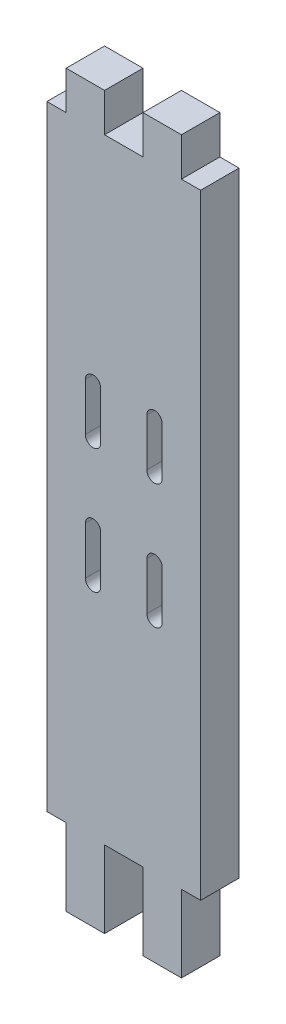
ISO-10303-21;
HEADER;
FILE_DESCRIPTION(('STEP AP214'),'2;1');
FILE_NAME('part.step','',(''),(''),'','','');
FILE_SCHEMA(('AUTOMOTIVE_DESIGN { 1 0 10303 214 1 1 1 1 }'));
ENDSEC;
DATA;
#1=APPLICATION_CONTEXT('core data for automotive mechanical design processes');
#2=APPLICATION_PROTOCOL_DEFINITION('international standard','automotive_design',2000,#1);
#3=PRODUCT_CONTEXT('',#1,'mechanical');
#4=PRODUCT('Part','Part','',(#3));
#5=PRODUCT_RELATED_PRODUCT_CATEGORY('part','',(#4));
#6=PRODUCT_DEFINITION_FORMATION('','',#4);
#7=PRODUCT_DEFINITION_CONTEXT('part definition',#1,'design');
#8=PRODUCT_DEFINITION('design','',#6,#7);
#9=PRODUCT_DEFINITION_SHAPE('','',#8);
#10=(LENGTH_UNIT() NAMED_UNIT(*) SI_UNIT(.MILLI.,.METRE.));
#11=(NAMED_UNIT(*) PLANE_ANGLE_UNIT() SI_UNIT($,.RADIAN.));
#12=(NAMED_UNIT(*) SI_UNIT($,.STERADIAN.) SOLID_ANGLE_UNIT());
#13=UNCERTAINTY_MEASURE_WITH_UNIT(LENGTH_MEASURE(1.E-05),#10,'distance_accuracy_value','');
#14=(GEOMETRIC_REPRESENTATION_CONTEXT(3) GLOBAL_UNCERTAINTY_ASSIGNED_CONTEXT((#13)) GLOBAL_UNIT_ASSIGNED_CONTEXT((#10,
#11,#12)) REPRESENTATION_CONTEXT('',''));
#15=CARTESIAN_POINT('',(0.,0.,0.));
#16=DIRECTION('',(0.,0.,1.));
#17=DIRECTION('',(1.,0.,0.));
#18=AXIS2_PLACEMENT_3D('',#15,#16,#17);
#19=CARTESIAN_POINT('',(0.,0.,5.));
#20=DIRECTION('',(0.,0.,1.));
#21=DIRECTION('',(1.,0.,0.));
#22=AXIS2_PLACEMENT_3D('',#19,#20,#21);
#23=PLANE('',#22);
#24=DIRECTION('',(-1.,0.,0.));
#25=VECTOR('',#24,1.);
#26=CARTESIAN_POINT('',(7.5,40.,5.));
#27=LINE('',#26,#25);
#28=CARTESIAN_POINT('',(10.,40.,5.));
#29=VERTEX_POINT('',#28);
#30=CARTESIAN_POINT('',(7.5,40.,5.));
#31=VERTEX_POINT('',#30);
#32=EDGE_CURVE('E436',#29,#31,#27,.T.);
#33=ORIENTED_EDGE('',*,*,#32,.T.);
#34=DIRECTION('',(0.,1.,0.));
#35=VECTOR('',#34,1.);
#36=CARTESIAN_POINT('',(7.5,45.,5.));
#37=LINE('',#36,#35);
#38=CARTESIAN_POINT('',(7.5,45.,5.));
#39=VERTEX_POINT('',#38);
#40=EDGE_CURVE('E441',#31,#39,#37,.T.);
#41=ORIENTED_EDGE('',*,*,#40,.T.);
#42=DIRECTION('',(-1.,0.,0.));
#43=VECTOR('',#42,1.);
#44=CARTESIAN_POINT('',(2.5,45.,5.));
#45=LINE('',#44,#43);
#46=CARTESIAN_POINT('',(2.5,45.,5.));
#47=VERTEX_POINT('',#46);
#48=EDGE_CURVE('E451',#39,#47,#45,.T.);
#49=ORIENTED_EDGE('',*,*,#48,.T.);
#50=DIRECTION('',(0.,-1.,0.));
#51=VECTOR('',#50,1.);
#52=CARTESIAN_POINT('',(2.5,40.,5.));
#53=LINE('',#52,#51);
#54=CARTESIAN_POINT('',(2.5,40.,5.));
#55=VERTEX_POINT('',#54);
#56=EDGE_CURVE('E454',#47,#55,#53,.T.);
#57=ORIENTED_EDGE('',*,*,#56,.T.);
#58=DIRECTION('',(-1.,0.,0.));
#59=VECTOR('',#58,1.);
#60=CARTESIAN_POINT('',(-2.5,40.,5.));
#61=LINE('',#60,#59);
#62=CARTESIAN_POINT('',(-2.5,40.,5.));
#63=VERTEX_POINT('',#62);
#64=EDGE_CURVE('E458',#55,#63,#61,.T.);
#65=ORIENTED_EDGE('',*,*,#64,.T.);
#66=DIRECTION('',(0.,1.,0.));
#67=VECTOR('',#66,1.);
#68=CARTESIAN_POINT('',(-2.5,45.,5.));
#69=LINE('',#68,#67);
#70=CARTESIAN_POINT('',(-2.5,45.,5.));
#71=VERTEX_POINT('',#70);
#72=EDGE_CURVE('E462',#63,#71,#69,.T.);
#73=ORIENTED_EDGE('',*,*,#72,.T.);
#74=DIRECTION('',(-1.,0.,0.));
#75=VECTOR('',#74,1.);
#76=CARTESIAN_POINT('',(-7.5,45.,5.));
#77=LINE('',#76,#75);
#78=CARTESIAN_POINT('',(-7.5,45.,5.));
#79=VERTEX_POINT('',#78);
#80=EDGE_CURVE('E470',#71,#79,#77,.T.);
#81=ORIENTED_EDGE('',*,*,#80,.T.);
#82=DIRECTION('',(0.,-1.,0.));
#83=VECTOR('',#82,1.);
#84=CARTESIAN_POINT('',(-7.5,40.,5.));
#85=LINE('',#84,#83);
#86=CARTESIAN_POINT('',(-7.5,40.,5.));
#87=VERTEX_POINT('',#86);
#88=EDGE_CURVE('E473',#79,#87,#85,.T.);
#89=ORIENTED_EDGE('',*,*,#88,.T.);
#90=DIRECTION('',(-1.,0.,0.));
#91=VECTOR('',#90,1.);
#92=CARTESIAN_POINT('',(-10.,40.,5.));
#93=LINE('',#92,#91);
#94=CARTESIAN_POINT('',(-10.,40.,5.));
#95=VERTEX_POINT('',#94);
#96=EDGE_CURVE('E477',#87,#95,#93,.T.);
#97=ORIENTED_EDGE('',*,*,#96,.T.);
#98=DIRECTION('',(0.,-1.,0.));
#99=VECTOR('',#98,1.);
#100=CARTESIAN_POINT('',(-10.,-40.,5.));
#101=LINE('',#100,#99);
#102=CARTESIAN_POINT('',(-10.,-40.,5.));
#103=VERTEX_POINT('',#102);
#104=EDGE_CURVE('E481',#95,#103,#101,.T.);
#105=ORIENTED_EDGE('',*,*,#104,.T.);
#106=DIRECTION('',(1.,0.,0.));
#107=VECTOR('',#106,1.);
#108=CARTESIAN_POINT('',(-10.,-40.,5.));
#109=LINE('',#108,#107);
#110=CARTESIAN_POINT('',(-7.5,-40.,5.));
#111=VERTEX_POINT('',#110);
#112=EDGE_CURVE('E489',#103,#111,#109,.T.);
#113=ORIENTED_EDGE('',*,*,#112,.T.);
#114=DIRECTION('',(0.,-1.,0.));
#115=VECTOR('',#114,1.);
#116=CARTESIAN_POINT('',(-7.5,-40.,5.));
#117=LINE('',#116,#115);
#118=CARTESIAN_POINT('',(-7.5,-50.,5.));
#119=VERTEX_POINT('',#118);
#120=EDGE_CURVE('E492',#111,#119,#117,.T.);
#121=ORIENTED_EDGE('',*,*,#120,.T.);
#122=DIRECTION('',(1.,0.,0.));
#123=VECTOR('',#122,1.);
#124=CARTESIAN_POINT('',(-7.5,-50.,5.));
#125=LINE('',#124,#123);
#126=CARTESIAN_POINT('',(-2.5,-50.,5.));
#127=VERTEX_POINT('',#126);
#128=EDGE_CURVE('E496',#119,#127,#125,.T.);
#129=ORIENTED_EDGE('',*,*,#128,.T.);
#130=DIRECTION('',(0.,1.,0.));
#131=VECTOR('',#130,1.);
#132=CARTESIAN_POINT('',(-2.5,-50.,5.));
#133=LINE('',#132,#131);
#134=CARTESIAN_POINT('',(-2.5,-40.,5.));
#135=VERTEX_POINT('',#134);
#136=EDGE_CURVE('E500',#127,#135,#133,.T.);
#137=ORIENTED_EDGE('',*,*,#136,.T.);
#138=DIRECTION('',(1.,0.,0.));
#139=VECTOR('',#138,1.);
#140=CARTESIAN_POINT('',(-2.5,-40.,5.));
#141=LINE('',#140,#139);
#142=CARTESIAN_POINT('',(2.5,-40.,5.));
#143=VERTEX_POINT('',#142);
#144=EDGE_CURVE('E508',#135,#143,#141,.T.);
#145=ORIENTED_EDGE('',*,*,#144,.T.);
#146=DIRECTION('',(0.,-1.,0.));
#147=VECTOR('',#146,1.);
#148=CARTESIAN_POINT('',(2.5,-40.,5.));
#149=LINE('',#148,#147);
#150=CARTESIAN_POINT('',(2.5,-50.,5.));
#151=VERTEX_POINT('',#150);
#152=EDGE_CURVE('E511',#143,#151,#149,.T.);
#153=ORIENTED_EDGE('',*,*,#152,.T.);
#154=DIRECTION('',(1.,0.,0.));
#155=VECTOR('',#154,1.);
#156=CARTESIAN_POINT('',(2.5,-50.,5.));
#157=LINE('',#156,#155);
#158=CARTESIAN_POINT('',(7.5,-50.,5.));
#159=VERTEX_POINT('',#158);
#160=EDGE_CURVE('E515',#151,#159,#157,.T.);
#161=ORIENTED_EDGE('',*,*,#160,.T.);
#162=DIRECTION('',(0.,1.,0.));
#163=VECTOR('',#162,1.);
#164=CARTESIAN_POINT('',(7.5,-50.,5.));
#165=LINE('',#164,#163);
#166=CARTESIAN_POINT('',(7.5,-40.,5.));
#167=VERTEX_POINT('',#166);
#168=EDGE_CURVE('E519',#159,#167,#165,.T.);
#169=ORIENTED_EDGE('',*,*,#168,.T.);
#170=DIRECTION('',(1.,0.,0.));
#171=VECTOR('',#170,1.);
#172=CARTESIAN_POINT('',(7.5,-40.,5.));
#173=LINE('',#172,#171);
#174=CARTESIAN_POINT('',(10.,-40.,5.));
#175=VERTEX_POINT('',#174);
#176=EDGE_CURVE('E525',#167,#175,#173,.T.);
#177=ORIENTED_EDGE('',*,*,#176,.T.);
#178=DIRECTION('',(0.,1.,0.));
#179=VECTOR('',#178,1.);
#180=CARTESIAN_POINT('',(10.,-40.,5.));
#181=LINE('',#180,#179);
#182=EDGE_CURVE('E528',#175,#29,#181,.T.);
#183=ORIENTED_EDGE('',*,*,#182,.T.);
#184=EDGE_LOOP('',(#33,#41,#49,#57,#65,#73,#81,#89,#97,#105,#113,#121,#129,#137,#145,#153,#161,
#169,#177,#183));
#185=FACE_BOUND('',#184,.T.);
#186=DIRECTION('',(0.,1.,0.));
#187=VECTOR('',#186,1.);
#188=CARTESIAN_POINT('',(5.00000000000001,-11.2,5.));
#189=LINE('',#188,#187);
#190=CARTESIAN_POINT('',(5.00000000000001,-11.2,5.));
#191=VERTEX_POINT('',#190);
#192=CARTESIAN_POINT('',(5.,-4.99999999999999,5.));
#193=VERTEX_POINT('',#192);
#194=EDGE_CURVE('E400',#191,#193,#189,.T.);
#195=ORIENTED_EDGE('',*,*,#194,.F.);
#196=CARTESIAN_POINT('',(4.,-11.2,5.));
#197=DIRECTION('',(0.,0.,1.));
#198=DIRECTION('',(1.,0.,0.));
#199=AXIS2_PLACEMENT_3D('',#196,#197,#198);
#200=CIRCLE('',#199,1.);
#201=CARTESIAN_POINT('',(3.,-11.2,5.));
#202=VERTEX_POINT('',#201);
#203=EDGE_CURVE('E396',#202,#191,#200,.T.);
#204=ORIENTED_EDGE('',*,*,#203,.F.);
#205=DIRECTION('',(0.,-1.,0.));
#206=VECTOR('',#205,1.);
#207=CARTESIAN_POINT('',(3.,-11.2,5.));
#208=LINE('',#207,#206);
#209=CARTESIAN_POINT('',(3.,-4.99999999999999,5.));
#210=VERTEX_POINT('',#209);
#211=EDGE_CURVE('E409',#210,#202,#208,.T.);
#212=ORIENTED_EDGE('',*,*,#211,.F.);
#213=CARTESIAN_POINT('',(4.,-4.99999999999999,5.));
#214=DIRECTION('',(0.,0.,1.));
#215=DIRECTION('',(1.,0.,0.));
#216=AXIS2_PLACEMENT_3D('',#213,#214,#215);
#217=CIRCLE('',#216,1.);
#218=EDGE_CURVE('E414',#193,#210,#217,.T.);
#219=ORIENTED_EDGE('',*,*,#218,.F.);
#220=EDGE_LOOP('',(#195,#204,#212,#219));
#221=FACE_BOUND('',#220,.T.);
#222=DIRECTION('',(0.,-1.,0.));
#223=VECTOR('',#222,1.);
#224=CARTESIAN_POINT('',(3.,11.2,5.));
#225=LINE('',#224,#223);
#226=CARTESIAN_POINT('',(3.,11.2,5.));
#227=VERTEX_POINT('',#226);
#228=CARTESIAN_POINT('',(3.,5.00000000000001,5.));
#229=VERTEX_POINT('',#228);
#230=EDGE_CURVE('E360',#227,#229,#225,.T.);
#231=ORIENTED_EDGE('',*,*,#230,.F.);
#232=CARTESIAN_POINT('',(4.,11.2,5.));
#233=DIRECTION('',(0.,0.,1.));
#234=DIRECTION('',(-1.,0.,0.));
#235=AXIS2_PLACEMENT_3D('',#232,#233,#234);
#236=CIRCLE('',#235,1.);
#237=CARTESIAN_POINT('',(5.00000000000001,11.2,5.));
#238=VERTEX_POINT('',#237);
#239=EDGE_CURVE('E356',#238,#227,#236,.T.);
#240=ORIENTED_EDGE('',*,*,#239,.F.);
#241=DIRECTION('',(0.,1.,0.));
#242=VECTOR('',#241,1.);
#243=CARTESIAN_POINT('',(5.00000000000001,11.2,5.));
#244=LINE('',#243,#242);
#245=CARTESIAN_POINT('',(5.,5.00000000000001,5.));
#246=VERTEX_POINT('',#245);
#247=EDGE_CURVE('E369',#246,#238,#244,.T.);
#248=ORIENTED_EDGE('',*,*,#247,.F.);
#249=CARTESIAN_POINT('',(4.,5.00000000000001,5.));
#250=DIRECTION('',(0.,0.,1.));
#251=DIRECTION('',(-1.,0.,0.));
#252=AXIS2_PLACEMENT_3D('',#249,#250,#251);
#253=CIRCLE('',#252,1.);
#254=EDGE_CURVE('E374',#229,#246,#253,.T.);
#255=ORIENTED_EDGE('',*,*,#254,.F.);
#256=EDGE_LOOP('',(#231,#240,#248,#255));
#257=FACE_BOUND('',#256,.T.);
#258=DIRECTION('',(0.,-1.,0.));
#259=VECTOR('',#258,1.);
#260=CARTESIAN_POINT('',(-5.00000000000001,11.2,5.));
#261=LINE('',#260,#259);
#262=CARTESIAN_POINT('',(-5.00000000000001,11.2,5.));
#263=VERTEX_POINT('',#262);
#264=CARTESIAN_POINT('',(-5.,5.,5.));
#265=VERTEX_POINT('',#264);
#266=EDGE_CURVE('E322',#263,#265,#261,.T.);
#267=ORIENTED_EDGE('',*,*,#266,.F.);
#268=CARTESIAN_POINT('',(-4.00000000000001,11.2,5.));
#269=DIRECTION('',(0.,0.,1.));
#270=DIRECTION('',(1.,0.,0.));
#271=AXIS2_PLACEMENT_3D('',#268,#269,#270);
#272=CIRCLE('',#271,1.);
#273=CARTESIAN_POINT('',(-3.00000000000001,11.2,5.));
#274=VERTEX_POINT('',#273);
#275=EDGE_CURVE('E318',#274,#263,#272,.T.);
#276=ORIENTED_EDGE('',*,*,#275,.F.);
#277=DIRECTION('',(0.,1.,0.));
#278=VECTOR('',#277,1.);
#279=CARTESIAN_POINT('',(-3.00000000000001,11.2,5.));
#280=LINE('',#279,#278);
#281=CARTESIAN_POINT('',(-3.,5.,5.));
#282=VERTEX_POINT('',#281);
#283=EDGE_CURVE('E329',#282,#274,#280,.T.);
#284=ORIENTED_EDGE('',*,*,#283,.F.);
#285=CARTESIAN_POINT('',(-4.,5.,5.));
#286=DIRECTION('',(0.,0.,1.));
#287=DIRECTION('',(1.,0.,0.));
#288=AXIS2_PLACEMENT_3D('',#285,#286,#287);
#289=CIRCLE('',#288,1.);
#290=EDGE_CURVE('E334',#265,#282,#289,.T.);
#291=ORIENTED_EDGE('',*,*,#290,.F.);
#292=EDGE_LOOP('',(#267,#276,#284,#291));
#293=FACE_BOUND('',#292,.T.);
#294=DIRECTION('',(0.,1.,0.));
#295=VECTOR('',#294,1.);
#296=CARTESIAN_POINT('',(-3.00000000000001,-11.2,5.));
#297=LINE('',#296,#295);
#298=CARTESIAN_POINT('',(-3.00000000000001,-11.2,5.));
#299=VERTEX_POINT('',#298);
#300=CARTESIAN_POINT('',(-3.,-4.99999999999999,5.));
#301=VERTEX_POINT('',#300);
#302=EDGE_CURVE('E278',#299,#301,#297,.T.);
#303=ORIENTED_EDGE('',*,*,#302,.F.);
#304=CARTESIAN_POINT('',(-4.00000000000001,-11.2,5.));
#305=DIRECTION('',(0.,0.,1.));
#306=DIRECTION('',(-1.,0.,0.));
#307=AXIS2_PLACEMENT_3D('',#304,#305,#306);
#308=CIRCLE('',#307,1.);
#309=CARTESIAN_POINT('',(-5.00000000000001,-11.2,5.));
#310=VERTEX_POINT('',#309);
#311=EDGE_CURVE('E269',#310,#299,#308,.T.);
#312=ORIENTED_EDGE('',*,*,#311,.F.);
#313=DIRECTION('',(0.,-1.,0.));
#314=VECTOR('',#313,1.);
#315=CARTESIAN_POINT('',(-5.00000000000001,-11.2,5.));
#316=LINE('',#315,#314);
#317=CARTESIAN_POINT('',(-5.,-4.99999999999999,5.));
#318=VERTEX_POINT('',#317);
#319=EDGE_CURVE('E295',#318,#310,#316,.T.);
#320=ORIENTED_EDGE('',*,*,#319,.F.);
#321=CARTESIAN_POINT('',(-4.,-4.99999999999999,5.));
#322=DIRECTION('',(0.,0.,1.));
#323=DIRECTION('',(-1.,0.,0.));
#324=AXIS2_PLACEMENT_3D('',#321,#322,#323);
#325=CIRCLE('',#324,1.);
#326=EDGE_CURVE('E290',#301,#318,#325,.T.);
#327=ORIENTED_EDGE('',*,*,#326,.F.);
#328=EDGE_LOOP('',(#303,#312,#320,#327));
#329=FACE_BOUND('',#328,.T.);
#330=ADVANCED_FACE('F36',(#185,#221,#257,#293,#329),#23,.T.);
#331=CARTESIAN_POINT('',(0.,0.,0.));
#332=DIRECTION('',(0.,0.,1.));
#333=DIRECTION('',(1.,0.,0.));
#334=AXIS2_PLACEMENT_3D('',#331,#332,#333);
#335=PLANE('',#334);
#336=CARTESIAN_POINT('',(-4.00000000000001,11.2,0.));
#337=DIRECTION('',(0.,0.,1.));
#338=DIRECTION('',(1.,0.,0.));
#339=AXIS2_PLACEMENT_3D('',#336,#337,#338);
#340=CIRCLE('',#339,1.);
#341=CARTESIAN_POINT('',(-3.00000000000001,11.2,0.));
#342=VERTEX_POINT('',#341);
#343=CARTESIAN_POINT('',(-5.00000000000001,11.2,0.));
#344=VERTEX_POINT('',#343);
#345=EDGE_CURVE('E286',#342,#344,#340,.T.);
#346=ORIENTED_EDGE('',*,*,#345,.T.);
#347=DIRECTION('',(0.,-1.,0.));
#348=VECTOR('',#347,1.);
#349=CARTESIAN_POINT('',(-5.00000000000001,11.2,0.));
#350=LINE('',#349,#348);
#351=CARTESIAN_POINT('',(-5.,5.,0.));
#352=VERTEX_POINT('',#351);
#353=EDGE_CURVE('E338',#344,#352,#350,.T.);
#354=ORIENTED_EDGE('',*,*,#353,.T.);
#355=CARTESIAN_POINT('',(-4.,5.,0.));
#356=DIRECTION('',(0.,0.,1.));
#357=DIRECTION('',(1.,0.,0.));
#358=AXIS2_PLACEMENT_3D('',#355,#356,#357);
#359=CIRCLE('',#358,1.);
#360=CARTESIAN_POINT('',(-3.,5.,0.));
#361=VERTEX_POINT('',#360);
#362=EDGE_CURVE('E341',#352,#361,#359,.T.);
#363=ORIENTED_EDGE('',*,*,#362,.T.);
#364=DIRECTION('',(0.,1.,0.));
#365=VECTOR('',#364,1.);
#366=CARTESIAN_POINT('',(-3.00000000000001,11.2,0.));
#367=LINE('',#366,#365);
#368=EDGE_CURVE('E323',#361,#342,#367,.T.);
#369=ORIENTED_EDGE('',*,*,#368,.T.);
#370=EDGE_LOOP('',(#346,#354,#363,#369));
#371=FACE_BOUND('',#370,.T.);
#372=CARTESIAN_POINT('',(4.,-11.2,0.));
#373=DIRECTION('',(0.,0.,1.));
#374=DIRECTION('',(1.,0.,0.));
#375=AXIS2_PLACEMENT_3D('',#372,#373,#374);
#376=CIRCLE('',#375,1.);
#377=CARTESIAN_POINT('',(3.,-11.2,0.));
#378=VERTEX_POINT('',#377);
#379=CARTESIAN_POINT('',(5.00000000000001,-11.2,0.));
#380=VERTEX_POINT('',#379);
#381=EDGE_CURVE('E395',#378,#380,#376,.T.);
#382=ORIENTED_EDGE('',*,*,#381,.T.);
#383=DIRECTION('',(0.,1.,0.));
#384=VECTOR('',#383,1.);
#385=CARTESIAN_POINT('',(5.00000000000001,-11.2,0.));
#386=LINE('',#385,#384);
#387=CARTESIAN_POINT('',(5.,-4.99999999999999,0.));
#388=VERTEX_POINT('',#387);
#389=EDGE_CURVE('E418',#380,#388,#386,.T.);
#390=ORIENTED_EDGE('',*,*,#389,.T.);
#391=CARTESIAN_POINT('',(4.,-4.99999999999999,0.));
#392=DIRECTION('',(0.,0.,1.));
#393=DIRECTION('',(1.,0.,0.));
#394=AXIS2_PLACEMENT_3D('',#391,#392,#393);
#395=CIRCLE('',#394,1.);
#396=CARTESIAN_POINT('',(3.,-4.99999999999999,0.));
#397=VERTEX_POINT('',#396);
#398=EDGE_CURVE('E421',#388,#397,#395,.T.);
#399=ORIENTED_EDGE('',*,*,#398,.T.);
#400=DIRECTION('',(0.,-1.,0.));
#401=VECTOR('',#400,1.);
#402=CARTESIAN_POINT('',(3.,-11.2,0.));
#403=LINE('',#402,#401);
#404=EDGE_CURVE('E401',#397,#378,#403,.T.);
#405=ORIENTED_EDGE('',*,*,#404,.T.);
#406=EDGE_LOOP('',(#382,#390,#399,#405));
#407=FACE_BOUND('',#406,.T.);
#408=DIRECTION('',(-1.,0.,0.));
#409=VECTOR('',#408,1.);
#410=CARTESIAN_POINT('',(7.5,40.,0.));
#411=LINE('',#410,#409);
#412=CARTESIAN_POINT('',(10.,40.,0.));
#413=VERTEX_POINT('',#412);
#414=CARTESIAN_POINT('',(7.5,40.,0.));
#415=VERTEX_POINT('',#414);
#416=EDGE_CURVE('E435',#413,#415,#411,.T.);
#417=ORIENTED_EDGE('',*,*,#416,.F.);
#418=DIRECTION('',(0.,1.,0.));
#419=VECTOR('',#418,1.);
#420=CARTESIAN_POINT('',(10.,-40.,0.));
#421=LINE('',#420,#419);
#422=CARTESIAN_POINT('',(10.,-40.,0.));
#423=VERTEX_POINT('',#422);
#424=EDGE_CURVE('E442',#423,#413,#421,.T.);
#425=ORIENTED_EDGE('',*,*,#424,.F.);
#426=DIRECTION('',(1.,0.,0.));
#427=VECTOR('',#426,1.);
#428=CARTESIAN_POINT('',(7.5,-40.,0.));
#429=LINE('',#428,#427);
#430=CARTESIAN_POINT('',(7.5,-40.,0.));
#431=VERTEX_POINT('',#430);
#432=EDGE_CURVE('E571',#431,#423,#429,.T.);
#433=ORIENTED_EDGE('',*,*,#432,.F.);
#434=DIRECTION('',(0.,1.,0.));
#435=VECTOR('',#434,1.);
#436=CARTESIAN_POINT('',(7.5,-50.,0.));
#437=LINE('',#436,#435);
#438=CARTESIAN_POINT('',(7.5,-50.,0.));
#439=VERTEX_POINT('',#438);
#440=EDGE_CURVE('E569',#439,#431,#437,.T.);
#441=ORIENTED_EDGE('',*,*,#440,.F.);
#442=DIRECTION('',(1.,0.,0.));
#443=VECTOR('',#442,1.);
#444=CARTESIAN_POINT('',(2.5,-50.,0.));
#445=LINE('',#444,#443);
#446=CARTESIAN_POINT('',(2.5,-50.,0.));
#447=VERTEX_POINT('',#446);
#448=EDGE_CURVE('E567',#447,#439,#445,.T.);
#449=ORIENTED_EDGE('',*,*,#448,.F.);
#450=DIRECTION('',(0.,-1.,0.));
#451=VECTOR('',#450,1.);
#452=CARTESIAN_POINT('',(2.5,-45.,0.));
#453=LINE('',#452,#451);
#454=CARTESIAN_POINT('',(2.5,-40.,0.));
#455=VERTEX_POINT('',#454);
#456=EDGE_CURVE('E565',#455,#447,#453,.T.);
#457=ORIENTED_EDGE('',*,*,#456,.F.);
#458=DIRECTION('',(1.,0.,0.));
#459=VECTOR('',#458,1.);
#460=CARTESIAN_POINT('',(-2.5,-40.,0.));
#461=LINE('',#460,#459);
#462=CARTESIAN_POINT('',(-2.5,-40.,0.));
#463=VERTEX_POINT('',#462);
#464=EDGE_CURVE('E562',#463,#455,#461,.T.);
#465=ORIENTED_EDGE('',*,*,#464,.F.);
#466=DIRECTION('',(0.,1.,0.));
#467=VECTOR('',#466,1.);
#468=CARTESIAN_POINT('',(-2.5,-50.,0.));
#469=LINE('',#468,#467);
#470=CARTESIAN_POINT('',(-2.5,-50.,0.));
#471=VERTEX_POINT('',#470);
#472=EDGE_CURVE('E560',#471,#463,#469,.T.);
#473=ORIENTED_EDGE('',*,*,#472,.F.);
#474=DIRECTION('',(1.,0.,0.));
#475=VECTOR('',#474,1.);
#476=CARTESIAN_POINT('',(-7.5,-50.,0.));
#477=LINE('',#476,#475);
#478=CARTESIAN_POINT('',(-7.5,-50.,0.));
#479=VERTEX_POINT('',#478);
#480=EDGE_CURVE('E558',#479,#471,#477,.T.);
#481=ORIENTED_EDGE('',*,*,#480,.F.);
#482=DIRECTION('',(0.,-1.,0.));
#483=VECTOR('',#482,1.);
#484=CARTESIAN_POINT('',(-7.5,-45.,0.));
#485=LINE('',#484,#483);
#486=CARTESIAN_POINT('',(-7.5,-40.,0.));
#487=VERTEX_POINT('',#486);
#488=EDGE_CURVE('E556',#487,#479,#485,.T.);
#489=ORIENTED_EDGE('',*,*,#488,.F.);
#490=DIRECTION('',(1.,0.,0.));
#491=VECTOR('',#490,1.);
#492=CARTESIAN_POINT('',(-10.,-40.,0.));
#493=LINE('',#492,#491);
#494=CARTESIAN_POINT('',(-10.,-40.,0.));
#495=VERTEX_POINT('',#494);
#496=EDGE_CURVE('E553',#495,#487,#493,.T.);
#497=ORIENTED_EDGE('',*,*,#496,.F.);
#498=DIRECTION('',(0.,-1.,0.));
#499=VECTOR('',#498,1.);
#500=CARTESIAN_POINT('',(-10.,-40.,0.));
#501=LINE('',#500,#499);
#502=CARTESIAN_POINT('',(-10.,40.,0.));
#503=VERTEX_POINT('',#502);
#504=EDGE_CURVE('E551',#503,#495,#501,.T.);
#505=ORIENTED_EDGE('',*,*,#504,.F.);
#506=DIRECTION('',(-1.,0.,0.));
#507=VECTOR('',#506,1.);
#508=CARTESIAN_POINT('',(-10.,40.,0.));
#509=LINE('',#508,#507);
#510=CARTESIAN_POINT('',(-7.5,40.,0.));
#511=VERTEX_POINT('',#510);
#512=EDGE_CURVE('E549',#511,#503,#509,.T.);
#513=ORIENTED_EDGE('',*,*,#512,.F.);
#514=DIRECTION('',(0.,-1.,0.));
#515=VECTOR('',#514,1.);
#516=CARTESIAN_POINT('',(-7.5,40.,0.));
#517=LINE('',#516,#515);
#518=CARTESIAN_POINT('',(-7.5,45.,0.));
#519=VERTEX_POINT('',#518);
#520=EDGE_CURVE('E547',#519,#511,#517,.T.);
#521=ORIENTED_EDGE('',*,*,#520,.F.);
#522=DIRECTION('',(-1.,0.,0.));
#523=VECTOR('',#522,1.);
#524=CARTESIAN_POINT('',(-7.5,45.,0.));
#525=LINE('',#524,#523);
#526=CARTESIAN_POINT('',(-2.5,45.,0.));
#527=VERTEX_POINT('',#526);
#528=EDGE_CURVE('E545',#527,#519,#525,.T.);
#529=ORIENTED_EDGE('',*,*,#528,.F.);
#530=DIRECTION('',(0.,1.,0.));
#531=VECTOR('',#530,1.);
#532=CARTESIAN_POINT('',(-2.5,45.,0.));
#533=LINE('',#532,#531);
#534=CARTESIAN_POINT('',(-2.5,40.,0.));
#535=VERTEX_POINT('',#534);
#536=EDGE_CURVE('E543',#535,#527,#533,.T.);
#537=ORIENTED_EDGE('',*,*,#536,.F.);
#538=DIRECTION('',(-1.,0.,0.));
#539=VECTOR('',#538,1.);
#540=CARTESIAN_POINT('',(-2.5,40.,0.));
#541=LINE('',#540,#539);
#542=CARTESIAN_POINT('',(2.5,40.,0.));
#543=VERTEX_POINT('',#542);
#544=EDGE_CURVE('E541',#543,#535,#541,.T.);
#545=ORIENTED_EDGE('',*,*,#544,.F.);
#546=DIRECTION('',(0.,-1.,0.));
#547=VECTOR('',#546,1.);
#548=CARTESIAN_POINT('',(2.5,40.,0.));
#549=LINE('',#548,#547);
#550=CARTESIAN_POINT('',(2.5,45.,0.));
#551=VERTEX_POINT('',#550);
#552=EDGE_CURVE('E539',#551,#543,#549,.T.);
#553=ORIENTED_EDGE('',*,*,#552,.F.);
#554=DIRECTION('',(-1.,0.,0.));
#555=VECTOR('',#554,1.);
#556=CARTESIAN_POINT('',(2.5,45.,0.));
#557=LINE('',#556,#555);
#558=CARTESIAN_POINT('',(7.5,45.,0.));
#559=VERTEX_POINT('',#558);
#560=EDGE_CURVE('E537',#559,#551,#557,.T.);
#561=ORIENTED_EDGE('',*,*,#560,.F.);
#562=DIRECTION('',(0.,1.,0.));
#563=VECTOR('',#562,1.);
#564=CARTESIAN_POINT('',(7.5,45.,0.));
#565=LINE('',#564,#563);
#566=EDGE_CURVE('E535',#415,#559,#565,.T.);
#567=ORIENTED_EDGE('',*,*,#566,.F.);
#568=EDGE_LOOP('',(#417,#425,#433,#441,#449,#457,#465,#473,#481,#489,#497,#505,#513,#521,#529,
#537,#545,#553,#561,#567));
#569=FACE_BOUND('',#568,.T.);
#570=CARTESIAN_POINT('',(4.,11.2,0.));
#571=DIRECTION('',(0.,0.,1.));
#572=DIRECTION('',(-1.,0.,0.));
#573=AXIS2_PLACEMENT_3D('',#570,#571,#572);
#574=CIRCLE('',#573,1.);
#575=CARTESIAN_POINT('',(5.00000000000001,11.2,0.));
#576=VERTEX_POINT('',#575);
#577=CARTESIAN_POINT('',(3.,11.2,0.));
#578=VERTEX_POINT('',#577);
#579=EDGE_CURVE('E355',#576,#578,#574,.T.);
#580=ORIENTED_EDGE('',*,*,#579,.T.);
#581=DIRECTION('',(0.,-1.,0.));
#582=VECTOR('',#581,1.);
#583=CARTESIAN_POINT('',(3.,11.2,0.));
#584=LINE('',#583,#582);
#585=CARTESIAN_POINT('',(3.,5.00000000000001,0.));
#586=VERTEX_POINT('',#585);
#587=EDGE_CURVE('E378',#578,#586,#584,.T.);
#588=ORIENTED_EDGE('',*,*,#587,.T.);
#589=CARTESIAN_POINT('',(4.,5.00000000000001,0.));
#590=DIRECTION('',(0.,0.,1.));
#591=DIRECTION('',(-1.,0.,0.));
#592=AXIS2_PLACEMENT_3D('',#589,#590,#591);
#593=CIRCLE('',#592,1.);
#594=CARTESIAN_POINT('',(5.,5.00000000000001,0.));
#595=VERTEX_POINT('',#594);
#596=EDGE_CURVE('E381',#586,#595,#593,.T.);
#597=ORIENTED_EDGE('',*,*,#596,.T.);
#598=DIRECTION('',(0.,1.,0.));
#599=VECTOR('',#598,1.);
#600=CARTESIAN_POINT('',(5.00000000000001,11.2,0.));
#601=LINE('',#600,#599);
#602=EDGE_CURVE('E361',#595,#576,#601,.T.);
#603=ORIENTED_EDGE('',*,*,#602,.T.);
#604=EDGE_LOOP('',(#580,#588,#597,#603));
#605=FACE_BOUND('',#604,.T.);
#606=CARTESIAN_POINT('',(-4.00000000000001,-11.2,0.));
#607=DIRECTION('',(0.,0.,1.));
#608=DIRECTION('',(-1.,0.,0.));
#609=AXIS2_PLACEMENT_3D('',#606,#607,#608);
#610=CIRCLE('',#609,1.);
#611=CARTESIAN_POINT('',(-5.00000000000001,-11.2,0.));
#612=VERTEX_POINT('',#611);
#613=CARTESIAN_POINT('',(-3.00000000000001,-11.2,0.));
#614=VERTEX_POINT('',#613);
#615=EDGE_CURVE('E59',#612,#614,#610,.T.);
#616=ORIENTED_EDGE('',*,*,#615,.T.);
#617=DIRECTION('',(0.,1.,0.));
#618=VECTOR('',#617,1.);
#619=CARTESIAN_POINT('',(-3.00000000000001,-11.2,0.));
#620=LINE('',#619,#618);
#621=CARTESIAN_POINT('',(-3.,-4.99999999999999,0.));
#622=VERTEX_POINT('',#621);
#623=EDGE_CURVE('E285',#614,#622,#620,.T.);
#624=ORIENTED_EDGE('',*,*,#623,.T.);
#625=CARTESIAN_POINT('',(-4.,-4.99999999999999,0.));
#626=DIRECTION('',(0.,0.,1.));
#627=DIRECTION('',(-1.,0.,0.));
#628=AXIS2_PLACEMENT_3D('',#625,#626,#627);
#629=CIRCLE('',#628,1.);
#630=CARTESIAN_POINT('',(-5.,-4.99999999999999,0.));
#631=VERTEX_POINT('',#630);
#632=EDGE_CURVE('E310',#622,#631,#629,.T.);
#633=ORIENTED_EDGE('',*,*,#632,.T.);
#634=DIRECTION('',(0.,-1.,0.));
#635=VECTOR('',#634,1.);
#636=CARTESIAN_POINT('',(-5.00000000000001,-11.2,0.));
#637=LINE('',#636,#635);
#638=EDGE_CURVE('E279',#631,#612,#637,.T.);
#639=ORIENTED_EDGE('',*,*,#638,.T.);
#640=EDGE_LOOP('',(#616,#624,#633,#639));
#641=FACE_BOUND('',#640,.T.);
#642=ADVANCED_FACE('F637',(#371,#407,#569,#605,#641),#335,.F.);
#643=CARTESIAN_POINT('',(7.5,40.,5.));
#644=DIRECTION('',(0.,-1.,0.));
#645=DIRECTION('',(0.,0.,-1.));
#646=AXIS2_PLACEMENT_3D('',#643,#644,#645);
#647=PLANE('',#646);
#648=ORIENTED_EDGE('',*,*,#416,.T.);
#649=DIRECTION('',(0.,0.,-1.));
#650=VECTOR('',#649,1.);
#651=CARTESIAN_POINT('',(7.5,40.,5.));
#652=LINE('',#651,#650);
#653=EDGE_CURVE('E12',#31,#415,#652,.T.);
#654=ORIENTED_EDGE('',*,*,#653,.F.);
#655=ORIENTED_EDGE('',*,*,#32,.F.);
#656=DIRECTION('',(0.,0.,-1.));
#657=VECTOR('',#656,1.);
#658=CARTESIAN_POINT('',(10.,40.,5.));
#659=LINE('',#658,#657);
#660=EDGE_CURVE('E532',#29,#413,#659,.T.);
#661=ORIENTED_EDGE('',*,*,#660,.T.);
#662=EDGE_LOOP('',(#648,#654,#655,#661));
#663=FACE_BOUND('',#662,.T.);
#664=ADVANCED_FACE('F38',(#663),#647,.F.);
#665=CARTESIAN_POINT('',(7.5,45.,5.));
#666=DIRECTION('',(-1.,0.,0.));
#667=DIRECTION('',(0.,0.,1.));
#668=AXIS2_PLACEMENT_3D('',#665,#666,#667);
#669=PLANE('',#668);
#670=ORIENTED_EDGE('',*,*,#566,.T.);
#671=DIRECTION('',(0.,0.,-1.));
#672=VECTOR('',#671,1.);
#673=CARTESIAN_POINT('',(7.5,45.,5.));
#674=LINE('',#673,#672);
#675=EDGE_CURVE('E44',#39,#559,#674,.T.);
#676=ORIENTED_EDGE('',*,*,#675,.F.);
#677=ORIENTED_EDGE('',*,*,#40,.F.);
#678=ORIENTED_EDGE('',*,*,#653,.T.);
#679=EDGE_LOOP('',(#670,#676,#677,#678));
#680=FACE_BOUND('',#679,.T.);
#681=ADVANCED_FACE('F772',(#680),#669,.F.);
#682=CARTESIAN_POINT('',(2.5,45.,5.));
#683=DIRECTION('',(0.,-1.,0.));
#684=DIRECTION('',(1.,0.,0.));
#685=AXIS2_PLACEMENT_3D('',#682,#683,#684);
#686=PLANE('',#685);
#687=ORIENTED_EDGE('',*,*,#560,.T.);
#688=DIRECTION('',(0.,0.,-1.));
#689=VECTOR('',#688,1.);
#690=CARTESIAN_POINT('',(2.5,45.,5.));
#691=LINE('',#690,#689);
#692=EDGE_CURVE('E624',#47,#551,#691,.T.);
#693=ORIENTED_EDGE('',*,*,#692,.F.);
#694=ORIENTED_EDGE('',*,*,#48,.F.);
#695=ORIENTED_EDGE('',*,*,#675,.T.);
#696=EDGE_LOOP('',(#687,#693,#694,#695));
#697=FACE_BOUND('',#696,.T.);
#698=ADVANCED_FACE('F631',(#697),#686,.F.);
#699=CARTESIAN_POINT('',(2.5,40.,5.));
#700=DIRECTION('',(1.,0.,0.));
#701=DIRECTION('',(0.,0.,-1.));
#702=AXIS2_PLACEMENT_3D('',#699,#700,#701);
#703=PLANE('',#702);
#704=ORIENTED_EDGE('',*,*,#552,.T.);
#705=DIRECTION('',(0.,0.,-1.));
#706=VECTOR('',#705,1.);
#707=CARTESIAN_POINT('',(2.5,40.,5.));
#708=LINE('',#707,#706);
#709=EDGE_CURVE('E621',#55,#543,#708,.T.);
#710=ORIENTED_EDGE('',*,*,#709,.F.);
#711=ORIENTED_EDGE('',*,*,#56,.F.);
#712=ORIENTED_EDGE('',*,*,#692,.T.);
#713=EDGE_LOOP('',(#704,#710,#711,#712));
#714=FACE_BOUND('',#713,.T.);
#715=ADVANCED_FACE('F643',(#714),#703,.F.);
#716=CARTESIAN_POINT('',(-2.5,40.,5.));
#717=DIRECTION('',(0.,-1.,0.));
#718=DIRECTION('',(0.,0.,-1.));
#719=AXIS2_PLACEMENT_3D('',#716,#717,#718);
#720=PLANE('',#719);
#721=ORIENTED_EDGE('',*,*,#544,.T.);
#722=DIRECTION('',(0.,0.,-1.));
#723=VECTOR('',#722,1.);
#724=CARTESIAN_POINT('',(-2.5,40.,5.));
#725=LINE('',#724,#723);
#726=EDGE_CURVE('E618',#63,#535,#725,.T.);
#727=ORIENTED_EDGE('',*,*,#726,.F.);
#728=ORIENTED_EDGE('',*,*,#64,.F.);
#729=ORIENTED_EDGE('',*,*,#709,.T.);
#730=EDGE_LOOP('',(#721,#727,#728,#729));
#731=FACE_BOUND('',#730,.T.);
#732=ADVANCED_FACE('F647',(#731),#720,.F.);
#733=CARTESIAN_POINT('',(-2.5,45.,5.));
#734=DIRECTION('',(-1.,0.,0.));
#735=DIRECTION('',(0.,0.,1.));
#736=AXIS2_PLACEMENT_3D('',#733,#734,#735);
#737=PLANE('',#736);
#738=ORIENTED_EDGE('',*,*,#536,.T.);
#739=DIRECTION('',(0.,0.,-1.));
#740=VECTOR('',#739,1.);
#741=CARTESIAN_POINT('',(-2.5,45.,5.));
#742=LINE('',#741,#740);
#743=EDGE_CURVE('E615',#71,#527,#742,.T.);
#744=ORIENTED_EDGE('',*,*,#743,.F.);
#745=ORIENTED_EDGE('',*,*,#72,.F.);
#746=ORIENTED_EDGE('',*,*,#726,.T.);
#747=EDGE_LOOP('',(#738,#744,#745,#746));
#748=FACE_BOUND('',#747,.T.);
#749=ADVANCED_FACE('F762',(#748),#737,.F.);
#750=CARTESIAN_POINT('',(-7.5,45.,5.));
#751=DIRECTION('',(0.,-1.,0.));
#752=DIRECTION('',(0.,0.,-1.));
#753=AXIS2_PLACEMENT_3D('',#750,#751,#752);
#754=PLANE('',#753);
#755=ORIENTED_EDGE('',*,*,#528,.T.);
#756=DIRECTION('',(0.,0.,-1.));
#757=VECTOR('',#756,1.);
#758=CARTESIAN_POINT('',(-7.5,45.,5.));
#759=LINE('',#758,#757);
#760=EDGE_CURVE('E612',#79,#519,#759,.T.);
#761=ORIENTED_EDGE('',*,*,#760,.F.);
#762=ORIENTED_EDGE('',*,*,#80,.F.);
#763=ORIENTED_EDGE('',*,*,#743,.T.);
#764=EDGE_LOOP('',(#755,#761,#762,#763));
#765=FACE_BOUND('',#764,.T.);
#766=ADVANCED_FACE('F758',(#765),#754,.F.);
#767=CARTESIAN_POINT('',(-7.5,40.,5.));
#768=DIRECTION('',(1.,0.,0.));
#769=DIRECTION('',(0.,0.,-1.));
#770=AXIS2_PLACEMENT_3D('',#767,#768,#769);
#771=PLANE('',#770);
#772=ORIENTED_EDGE('',*,*,#520,.T.);
#773=DIRECTION('',(0.,0.,-1.));
#774=VECTOR('',#773,1.);
#775=CARTESIAN_POINT('',(-7.5,40.,5.));
#776=LINE('',#775,#774);
#777=EDGE_CURVE('E609',#87,#511,#776,.T.);
#778=ORIENTED_EDGE('',*,*,#777,.F.);
#779=ORIENTED_EDGE('',*,*,#88,.F.);
#780=ORIENTED_EDGE('',*,*,#760,.T.);
#781=EDGE_LOOP('',(#772,#778,#779,#780));
#782=FACE_BOUND('',#781,.T.);
#783=ADVANCED_FACE('F754',(#782),#771,.F.);
#784=CARTESIAN_POINT('',(-10.,40.,5.));
#785=DIRECTION('',(0.,-1.,0.));
#786=DIRECTION('',(0.,0.,-1.));
#787=AXIS2_PLACEMENT_3D('',#784,#785,#786);
#788=PLANE('',#787);
#789=ORIENTED_EDGE('',*,*,#512,.T.);
#790=DIRECTION('',(0.,0.,-1.));
#791=VECTOR('',#790,1.);
#792=CARTESIAN_POINT('',(-10.,40.,5.));
#793=LINE('',#792,#791);
#794=EDGE_CURVE('E606',#95,#503,#793,.T.);
#795=ORIENTED_EDGE('',*,*,#794,.F.);
#796=ORIENTED_EDGE('',*,*,#96,.F.);
#797=ORIENTED_EDGE('',*,*,#777,.T.);
#798=EDGE_LOOP('',(#789,#795,#796,#797));
#799=FACE_BOUND('',#798,.T.);
#800=ADVANCED_FACE('F750',(#799),#788,.F.);
#801=CARTESIAN_POINT('',(-10.,-40.,5.));
#802=DIRECTION('',(1.,0.,0.));
#803=DIRECTION('',(0.,0.,-1.));
#804=AXIS2_PLACEMENT_3D('',#801,#802,#803);
#805=PLANE('',#804);
#806=ORIENTED_EDGE('',*,*,#504,.T.);
#807=DIRECTION('',(0.,0.,-1.));
#808=VECTOR('',#807,1.);
#809=CARTESIAN_POINT('',(-10.,-40.,5.));
#810=LINE('',#809,#808);
#811=EDGE_CURVE('E603',#103,#495,#810,.T.);
#812=ORIENTED_EDGE('',*,*,#811,.F.);
#813=ORIENTED_EDGE('',*,*,#104,.F.);
#814=ORIENTED_EDGE('',*,*,#794,.T.);
#815=EDGE_LOOP('',(#806,#812,#813,#814));
#816=FACE_BOUND('',#815,.T.);
#817=ADVANCED_FACE('F746',(#816),#805,.F.);
#818=CARTESIAN_POINT('',(-10.,-40.,5.));
#819=DIRECTION('',(0.,1.,0.));
#820=DIRECTION('',(0.,0.,1.));
#821=AXIS2_PLACEMENT_3D('',#818,#819,#820);
#822=PLANE('',#821);
#823=ORIENTED_EDGE('',*,*,#496,.T.);
#824=DIRECTION('',(0.,0.,-1.));
#825=VECTOR('',#824,1.);
#826=CARTESIAN_POINT('',(-7.5,-40.,5.));
#827=LINE('',#826,#825);
#828=EDGE_CURVE('E600',#111,#487,#827,.T.);
#829=ORIENTED_EDGE('',*,*,#828,.F.);
#830=ORIENTED_EDGE('',*,*,#112,.F.);
#831=ORIENTED_EDGE('',*,*,#811,.T.);
#832=EDGE_LOOP('',(#823,#829,#830,#831));
#833=FACE_BOUND('',#832,.T.);
#834=ADVANCED_FACE('F742',(#833),#822,.F.);
#835=CARTESIAN_POINT('',(-7.5,-45.,5.));
#836=DIRECTION('',(1.,0.,0.));
#837=DIRECTION('',(0.,0.,-1.));
#838=AXIS2_PLACEMENT_3D('',#835,#836,#837);
#839=PLANE('',#838);
#840=ORIENTED_EDGE('',*,*,#488,.T.);
#841=DIRECTION('',(0.,0.,-1.));
#842=VECTOR('',#841,1.);
#843=CARTESIAN_POINT('',(-7.5,-50.,5.));
#844=LINE('',#843,#842);
#845=EDGE_CURVE('E597',#119,#479,#844,.T.);
#846=ORIENTED_EDGE('',*,*,#845,.F.);
#847=ORIENTED_EDGE('',*,*,#120,.F.);
#848=ORIENTED_EDGE('',*,*,#828,.T.);
#849=EDGE_LOOP('',(#840,#846,#847,#848));
#850=FACE_BOUND('',#849,.T.);
#851=ADVANCED_FACE('F738',(#850),#839,.F.);
#852=CARTESIAN_POINT('',(-7.5,-50.,5.));
#853=DIRECTION('',(0.,1.,0.));
#854=DIRECTION('',(0.,0.,1.));
#855=AXIS2_PLACEMENT_3D('',#852,#853,#854);
#856=PLANE('',#855);
#857=ORIENTED_EDGE('',*,*,#480,.T.);
#858=DIRECTION('',(0.,0.,-1.));
#859=VECTOR('',#858,1.);
#860=CARTESIAN_POINT('',(-2.5,-50.,5.));
#861=LINE('',#860,#859);
#862=EDGE_CURVE('E594',#127,#471,#861,.T.);
#863=ORIENTED_EDGE('',*,*,#862,.F.);
#864=ORIENTED_EDGE('',*,*,#128,.F.);
#865=ORIENTED_EDGE('',*,*,#845,.T.);
#866=EDGE_LOOP('',(#857,#863,#864,#865));
#867=FACE_BOUND('',#866,.T.);
#868=ADVANCED_FACE('F734',(#867),#856,.F.);
#869=CARTESIAN_POINT('',(-2.5,-50.,5.));
#870=DIRECTION('',(-1.,0.,0.));
#871=DIRECTION('',(0.,-1.,0.));
#872=AXIS2_PLACEMENT_3D('',#869,#870,#871);
#873=PLANE('',#872);
#874=ORIENTED_EDGE('',*,*,#472,.T.);
#875=DIRECTION('',(0.,0.,-1.));
#876=VECTOR('',#875,1.);
#877=CARTESIAN_POINT('',(-2.5,-40.,5.));
#878=LINE('',#877,#876);
#879=EDGE_CURVE('E591',#135,#463,#878,.T.);
#880=ORIENTED_EDGE('',*,*,#879,.F.);
#881=ORIENTED_EDGE('',*,*,#136,.F.);
#882=ORIENTED_EDGE('',*,*,#862,.T.);
#883=EDGE_LOOP('',(#874,#880,#881,#882));
#884=FACE_BOUND('',#883,.T.);
#885=ADVANCED_FACE('F730',(#884),#873,.F.);
#886=CARTESIAN_POINT('',(-2.5,-40.,5.));
#887=DIRECTION('',(0.,1.,0.));
#888=DIRECTION('',(0.,0.,1.));
#889=AXIS2_PLACEMENT_3D('',#886,#887,#888);
#890=PLANE('',#889);
#891=ORIENTED_EDGE('',*,*,#464,.T.);
#892=DIRECTION('',(0.,0.,-1.));
#893=VECTOR('',#892,1.);
#894=CARTESIAN_POINT('',(2.5,-40.,5.));
#895=LINE('',#894,#893);
#896=EDGE_CURVE('E588',#143,#455,#895,.T.);
#897=ORIENTED_EDGE('',*,*,#896,.F.);
#898=ORIENTED_EDGE('',*,*,#144,.F.);
#899=ORIENTED_EDGE('',*,*,#879,.T.);
#900=EDGE_LOOP('',(#891,#897,#898,#899));
#901=FACE_BOUND('',#900,.T.);
#902=ADVANCED_FACE('F726',(#901),#890,.F.);
#903=CARTESIAN_POINT('',(2.5,-45.,5.));
#904=DIRECTION('',(1.,0.,0.));
#905=DIRECTION('',(0.,1.,0.));
#906=AXIS2_PLACEMENT_3D('',#903,#904,#905);
#907=PLANE('',#906);
#908=ORIENTED_EDGE('',*,*,#456,.T.);
#909=DIRECTION('',(0.,0.,-1.));
#910=VECTOR('',#909,1.);
#911=CARTESIAN_POINT('',(2.5,-50.,5.));
#912=LINE('',#911,#910);
#913=EDGE_CURVE('E585',#151,#447,#912,.T.);
#914=ORIENTED_EDGE('',*,*,#913,.F.);
#915=ORIENTED_EDGE('',*,*,#152,.F.);
#916=ORIENTED_EDGE('',*,*,#896,.T.);
#917=EDGE_LOOP('',(#908,#914,#915,#916));
#918=FACE_BOUND('',#917,.T.);
#919=ADVANCED_FACE('F722',(#918),#907,.F.);
#920=CARTESIAN_POINT('',(2.5,-50.,5.));
#921=DIRECTION('',(0.,1.,0.));
#922=DIRECTION('',(0.,0.,1.));
#923=AXIS2_PLACEMENT_3D('',#920,#921,#922);
#924=PLANE('',#923);
#925=ORIENTED_EDGE('',*,*,#448,.T.);
#926=DIRECTION('',(0.,0.,-1.));
#927=VECTOR('',#926,1.);
#928=CARTESIAN_POINT('',(7.5,-50.,5.));
#929=LINE('',#928,#927);
#930=EDGE_CURVE('E582',#159,#439,#929,.T.);
#931=ORIENTED_EDGE('',*,*,#930,.F.);
#932=ORIENTED_EDGE('',*,*,#160,.F.);
#933=ORIENTED_EDGE('',*,*,#913,.T.);
#934=EDGE_LOOP('',(#925,#931,#932,#933));
#935=FACE_BOUND('',#934,.T.);
#936=ADVANCED_FACE('F718',(#935),#924,.F.);
#937=CARTESIAN_POINT('',(7.5,-50.,5.));
#938=DIRECTION('',(-1.,0.,0.));
#939=DIRECTION('',(0.,0.,1.));
#940=AXIS2_PLACEMENT_3D('',#937,#938,#939);
#941=PLANE('',#940);
#942=ORIENTED_EDGE('',*,*,#440,.T.);
#943=DIRECTION('',(0.,0.,-1.));
#944=VECTOR('',#943,1.);
#945=CARTESIAN_POINT('',(7.5,-40.,5.));
#946=LINE('',#945,#944);
#947=EDGE_CURVE('E579',#167,#431,#946,.T.);
#948=ORIENTED_EDGE('',*,*,#947,.F.);
#949=ORIENTED_EDGE('',*,*,#168,.F.);
#950=ORIENTED_EDGE('',*,*,#930,.T.);
#951=EDGE_LOOP('',(#942,#948,#949,#950));
#952=FACE_BOUND('',#951,.T.);
#953=ADVANCED_FACE('F714',(#952),#941,.F.);
#954=CARTESIAN_POINT('',(7.5,-40.,5.));
#955=DIRECTION('',(0.,1.,0.));
#956=DIRECTION('',(0.,0.,1.));
#957=AXIS2_PLACEMENT_3D('',#954,#955,#956);
#958=PLANE('',#957);
#959=ORIENTED_EDGE('',*,*,#432,.T.);
#960=DIRECTION('',(0.,0.,-1.));
#961=VECTOR('',#960,1.);
#962=CARTESIAN_POINT('',(10.,-40.,5.));
#963=LINE('',#962,#961);
#964=EDGE_CURVE('E576',#175,#423,#963,.T.);
#965=ORIENTED_EDGE('',*,*,#964,.F.);
#966=ORIENTED_EDGE('',*,*,#176,.F.);
#967=ORIENTED_EDGE('',*,*,#947,.T.);
#968=EDGE_LOOP('',(#959,#965,#966,#967));
#969=FACE_BOUND('',#968,.T.);
#970=ADVANCED_FACE('F710',(#969),#958,.F.);
#971=CARTESIAN_POINT('',(10.,-40.,5.));
#972=DIRECTION('',(-1.,0.,0.));
#973=DIRECTION('',(0.,0.,1.));
#974=AXIS2_PLACEMENT_3D('',#971,#972,#973);
#975=PLANE('',#974);
#976=ORIENTED_EDGE('',*,*,#424,.T.);
#977=ORIENTED_EDGE('',*,*,#660,.F.);
#978=ORIENTED_EDGE('',*,*,#182,.F.);
#979=ORIENTED_EDGE('',*,*,#964,.T.);
#980=EDGE_LOOP('',(#976,#977,#978,#979));
#981=FACE_BOUND('',#980,.T.);
#982=ADVANCED_FACE('F707',(#981),#975,.F.);
#983=CARTESIAN_POINT('',(4.,-11.2,5.));
#984=DIRECTION('',(0.,0.,-1.));
#985=DIRECTION('',(-1.,0.,0.));
#986=AXIS2_PLACEMENT_3D('',#983,#984,#985);
#987=CYLINDRICAL_SURFACE('',#986,1.);
#988=ORIENTED_EDGE('',*,*,#381,.F.);
#989=DIRECTION('',(0.,0.,-1.));
#990=VECTOR('',#989,1.);
#991=CARTESIAN_POINT('',(3.,-11.2,5.));
#992=LINE('',#991,#990);
#993=EDGE_CURVE('E413',#202,#378,#992,.T.);
#994=ORIENTED_EDGE('',*,*,#993,.F.);
#995=ORIENTED_EDGE('',*,*,#203,.T.);
#996=DIRECTION('',(0.,0.,-1.));
#997=VECTOR('',#996,1.);
#998=CARTESIAN_POINT('',(5.00000000000001,-11.2,5.));
#999=LINE('',#998,#997);
#1000=EDGE_CURVE('E432',#191,#380,#999,.T.);
#1001=ORIENTED_EDGE('',*,*,#1000,.T.);
#1002=EDGE_LOOP('',(#988,#994,#995,#1001));
#1003=FACE_BOUND('',#1002,.T.);
#1004=ADVANCED_FACE('F704',(#1003),#987,.F.);
#1005=CARTESIAN_POINT('',(5.00000000000001,-11.2,5.));
#1006=DIRECTION('',(-1.,0.,0.));
#1007=DIRECTION('',(0.,-1.,0.));
#1008=AXIS2_PLACEMENT_3D('',#1005,#1006,#1007);
#1009=PLANE('',#1008);
#1010=ORIENTED_EDGE('',*,*,#389,.F.);
#1011=ORIENTED_EDGE('',*,*,#1000,.F.);
#1012=ORIENTED_EDGE('',*,*,#194,.T.);
#1013=DIRECTION('',(0.,0.,-1.));
#1014=VECTOR('',#1013,1.);
#1015=CARTESIAN_POINT('',(5.,-4.99999999999999,5.));
#1016=LINE('',#1015,#1014);
#1017=EDGE_CURVE('E430',#193,#388,#1016,.T.);
#1018=ORIENTED_EDGE('',*,*,#1017,.T.);
#1019=EDGE_LOOP('',(#1010,#1011,#1012,#1018));
#1020=FACE_BOUND('',#1019,.T.);
#1021=ADVANCED_FACE('F940',(#1020),#1009,.T.);
#1022=CARTESIAN_POINT('',(4.,-4.99999999999999,5.));
#1023=DIRECTION('',(0.,0.,-1.));
#1024=DIRECTION('',(-1.,0.,0.));
#1025=AXIS2_PLACEMENT_3D('',#1022,#1023,#1024);
#1026=CYLINDRICAL_SURFACE('',#1025,1.);
#1027=ORIENTED_EDGE('',*,*,#398,.F.);
#1028=ORIENTED_EDGE('',*,*,#1017,.F.);
#1029=ORIENTED_EDGE('',*,*,#218,.T.);
#1030=DIRECTION('',(0.,0.,-1.));
#1031=VECTOR('',#1030,1.);
#1032=CARTESIAN_POINT('',(3.,-4.99999999999999,5.));
#1033=LINE('',#1032,#1031);
#1034=EDGE_CURVE('E428',#210,#397,#1033,.T.);
#1035=ORIENTED_EDGE('',*,*,#1034,.T.);
#1036=EDGE_LOOP('',(#1027,#1028,#1029,#1035));
#1037=FACE_BOUND('',#1036,.T.);
#1038=ADVANCED_FACE('F948',(#1037),#1026,.F.);
#1039=CARTESIAN_POINT('',(3.,-11.2,5.));
#1040=DIRECTION('',(1.,0.,0.));
#1041=DIRECTION('',(0.,1.,0.));
#1042=AXIS2_PLACEMENT_3D('',#1039,#1040,#1041);
#1043=PLANE('',#1042);
#1044=ORIENTED_EDGE('',*,*,#404,.F.);
#1045=ORIENTED_EDGE('',*,*,#1034,.F.);
#1046=ORIENTED_EDGE('',*,*,#211,.T.);
#1047=ORIENTED_EDGE('',*,*,#993,.T.);
#1048=EDGE_LOOP('',(#1044,#1045,#1046,#1047));
#1049=FACE_BOUND('',#1048,.T.);
#1050=ADVANCED_FACE('F956',(#1049),#1043,.T.);
#1051=CARTESIAN_POINT('',(4.,11.2,5.));
#1052=DIRECTION('',(0.,0.,-1.));
#1053=DIRECTION('',(-1.,0.,0.));
#1054=AXIS2_PLACEMENT_3D('',#1051,#1052,#1053);
#1055=CYLINDRICAL_SURFACE('',#1054,1.);
#1056=ORIENTED_EDGE('',*,*,#579,.F.);
#1057=DIRECTION('',(0.,0.,-1.));
#1058=VECTOR('',#1057,1.);
#1059=CARTESIAN_POINT('',(5.00000000000001,11.2,5.));
#1060=LINE('',#1059,#1058);
#1061=EDGE_CURVE('E373',#238,#576,#1060,.T.);
#1062=ORIENTED_EDGE('',*,*,#1061,.F.);
#1063=ORIENTED_EDGE('',*,*,#239,.T.);
#1064=DIRECTION('',(0.,0.,-1.));
#1065=VECTOR('',#1064,1.);
#1066=CARTESIAN_POINT('',(3.,11.2,5.));
#1067=LINE('',#1066,#1065);
#1068=EDGE_CURVE('E392',#227,#578,#1067,.T.);
#1069=ORIENTED_EDGE('',*,*,#1068,.T.);
#1070=EDGE_LOOP('',(#1056,#1062,#1063,#1069));
#1071=FACE_BOUND('',#1070,.T.);
#1072=ADVANCED_FACE('F965',(#1071),#1055,.F.);
#1073=CARTESIAN_POINT('',(3.,11.2,5.));
#1074=DIRECTION('',(1.,0.,0.));
#1075=DIRECTION('',(0.,1.,0.));
#1076=AXIS2_PLACEMENT_3D('',#1073,#1074,#1075);
#1077=PLANE('',#1076);
#1078=ORIENTED_EDGE('',*,*,#587,.F.);
#1079=ORIENTED_EDGE('',*,*,#1068,.F.);
#1080=ORIENTED_EDGE('',*,*,#230,.T.);
#1081=DIRECTION('',(0.,0.,-1.));
#1082=VECTOR('',#1081,1.);
#1083=CARTESIAN_POINT('',(3.,5.00000000000001,5.));
#1084=LINE('',#1083,#1082);
#1085=EDGE_CURVE('E390',#229,#586,#1084,.T.);
#1086=ORIENTED_EDGE('',*,*,#1085,.T.);
#1087=EDGE_LOOP('',(#1078,#1079,#1080,#1086));
#1088=FACE_BOUND('',#1087,.T.);
#1089=ADVANCED_FACE('F974',(#1088),#1077,.T.);
#1090=CARTESIAN_POINT('',(4.,5.00000000000001,5.));
#1091=DIRECTION('',(0.,0.,-1.));
#1092=DIRECTION('',(-1.,0.,0.));
#1093=AXIS2_PLACEMENT_3D('',#1090,#1091,#1092);
#1094=CYLINDRICAL_SURFACE('',#1093,1.);
#1095=ORIENTED_EDGE('',*,*,#596,.F.);
#1096=ORIENTED_EDGE('',*,*,#1085,.F.);
#1097=ORIENTED_EDGE('',*,*,#254,.T.);
#1098=DIRECTION('',(0.,0.,-1.));
#1099=VECTOR('',#1098,1.);
#1100=CARTESIAN_POINT('',(5.,5.00000000000001,5.));
#1101=LINE('',#1100,#1099);
#1102=EDGE_CURVE('E388',#246,#595,#1101,.T.);
#1103=ORIENTED_EDGE('',*,*,#1102,.T.);
#1104=EDGE_LOOP('',(#1095,#1096,#1097,#1103));
#1105=FACE_BOUND('',#1104,.T.);
#1106=ADVANCED_FACE('F983',(#1105),#1094,.F.);
#1107=CARTESIAN_POINT('',(5.00000000000001,11.2,5.));
#1108=DIRECTION('',(-1.,0.,0.));
#1109=DIRECTION('',(0.,-1.,0.));
#1110=AXIS2_PLACEMENT_3D('',#1107,#1108,#1109);
#1111=PLANE('',#1110);
#1112=ORIENTED_EDGE('',*,*,#602,.F.);
#1113=ORIENTED_EDGE('',*,*,#1102,.F.);
#1114=ORIENTED_EDGE('',*,*,#247,.T.);
#1115=ORIENTED_EDGE('',*,*,#1061,.T.);
#1116=EDGE_LOOP('',(#1112,#1113,#1114,#1115));
#1117=FACE_BOUND('',#1116,.T.);
#1118=ADVANCED_FACE('F695',(#1117),#1111,.T.);
#1119=CARTESIAN_POINT('',(-4.00000000000001,11.2,5.));
#1120=DIRECTION('',(0.,0.,-1.));
#1121=DIRECTION('',(-1.,0.,0.));
#1122=AXIS2_PLACEMENT_3D('',#1119,#1120,#1121);
#1123=CYLINDRICAL_SURFACE('',#1122,1.);
#1124=ORIENTED_EDGE('',*,*,#345,.F.);
#1125=DIRECTION('',(0.,0.,-1.));
#1126=VECTOR('',#1125,1.);
#1127=CARTESIAN_POINT('',(-3.00000000000001,11.2,5.));
#1128=LINE('',#1127,#1126);
#1129=EDGE_CURVE('E333',#274,#342,#1128,.T.);
#1130=ORIENTED_EDGE('',*,*,#1129,.F.);
#1131=ORIENTED_EDGE('',*,*,#275,.T.);
#1132=DIRECTION('',(0.,0.,-1.));
#1133=VECTOR('',#1132,1.);
#1134=CARTESIAN_POINT('',(-5.00000000000001,11.2,5.));
#1135=LINE('',#1134,#1133);
#1136=EDGE_CURVE('E352',#263,#344,#1135,.T.);
#1137=ORIENTED_EDGE('',*,*,#1136,.T.);
#1138=EDGE_LOOP('',(#1124,#1130,#1131,#1137));
#1139=FACE_BOUND('',#1138,.T.);
#1140=ADVANCED_FACE('F682',(#1139),#1123,.F.);
#1141=CARTESIAN_POINT('',(-5.00000000000001,11.2,5.));
#1142=DIRECTION('',(1.,0.,0.));
#1143=DIRECTION('',(0.,1.,0.));
#1144=AXIS2_PLACEMENT_3D('',#1141,#1142,#1143);
#1145=PLANE('',#1144);
#1146=ORIENTED_EDGE('',*,*,#353,.F.);
#1147=ORIENTED_EDGE('',*,*,#1136,.F.);
#1148=ORIENTED_EDGE('',*,*,#266,.T.);
#1149=DIRECTION('',(0.,0.,-1.));
#1150=VECTOR('',#1149,1.);
#1151=CARTESIAN_POINT('',(-5.,5.,5.));
#1152=LINE('',#1151,#1150);
#1153=EDGE_CURVE('E350',#265,#352,#1152,.T.);
#1154=ORIENTED_EDGE('',*,*,#1153,.T.);
#1155=EDGE_LOOP('',(#1146,#1147,#1148,#1154));
#1156=FACE_BOUND('',#1155,.T.);
#1157=ADVANCED_FACE('F687',(#1156),#1145,.T.);
#1158=CARTESIAN_POINT('',(-4.,5.,5.));
#1159=DIRECTION('',(0.,0.,-1.));
#1160=DIRECTION('',(-1.,0.,0.));
#1161=AXIS2_PLACEMENT_3D('',#1158,#1159,#1160);
#1162=CYLINDRICAL_SURFACE('',#1161,1.);
#1163=ORIENTED_EDGE('',*,*,#362,.F.);
#1164=ORIENTED_EDGE('',*,*,#1153,.F.);
#1165=ORIENTED_EDGE('',*,*,#290,.T.);
#1166=DIRECTION('',(0.,0.,-1.));
#1167=VECTOR('',#1166,1.);
#1168=CARTESIAN_POINT('',(-3.,5.,5.));
#1169=LINE('',#1168,#1167);
#1170=EDGE_CURVE('E348',#282,#361,#1169,.T.);
#1171=ORIENTED_EDGE('',*,*,#1170,.T.);
#1172=EDGE_LOOP('',(#1163,#1164,#1165,#1171));
#1173=FACE_BOUND('',#1172,.T.);
#1174=ADVANCED_FACE('F673',(#1173),#1162,.F.);
#1175=CARTESIAN_POINT('',(-3.00000000000001,11.2,5.));
#1176=DIRECTION('',(-1.,0.,0.));
#1177=DIRECTION('',(0.,-1.,0.));
#1178=AXIS2_PLACEMENT_3D('',#1175,#1176,#1177);
#1179=PLANE('',#1178);
#1180=ORIENTED_EDGE('',*,*,#368,.F.);
#1181=ORIENTED_EDGE('',*,*,#1170,.F.);
#1182=ORIENTED_EDGE('',*,*,#283,.T.);
#1183=ORIENTED_EDGE('',*,*,#1129,.T.);
#1184=EDGE_LOOP('',(#1180,#1181,#1182,#1183));
#1185=FACE_BOUND('',#1184,.T.);
#1186=ADVANCED_FACE('F680',(#1185),#1179,.T.);
#1187=CARTESIAN_POINT('',(-4.00000000000001,-11.2,5.));
#1188=DIRECTION('',(0.,0.,-1.));
#1189=DIRECTION('',(-1.,0.,0.));
#1190=AXIS2_PLACEMENT_3D('',#1187,#1188,#1189);
#1191=CYLINDRICAL_SURFACE('',#1190,1.);
#1192=ORIENTED_EDGE('',*,*,#615,.F.);
#1193=DIRECTION('',(0.,0.,-1.));
#1194=VECTOR('',#1193,1.);
#1195=CARTESIAN_POINT('',(-5.00000000000001,-11.2,5.));
#1196=LINE('',#1195,#1194);
#1197=EDGE_CURVE('E273',#310,#612,#1196,.T.);
#1198=ORIENTED_EDGE('',*,*,#1197,.F.);
#1199=ORIENTED_EDGE('',*,*,#311,.T.);
#1200=DIRECTION('',(0.,0.,-1.));
#1201=VECTOR('',#1200,1.);
#1202=CARTESIAN_POINT('',(-3.00000000000001,-11.2,5.));
#1203=LINE('',#1202,#1201);
#1204=EDGE_CURVE('E272',#299,#614,#1203,.T.);
#1205=ORIENTED_EDGE('',*,*,#1204,.T.);
#1206=EDGE_LOOP('',(#1192,#1198,#1199,#1205));
#1207=FACE_BOUND('',#1206,.T.);
#1208=ADVANCED_FACE('F271',(#1207),#1191,.F.);
#1209=CARTESIAN_POINT('',(-3.00000000000001,-11.2,5.));
#1210=DIRECTION('',(-1.,0.,0.));
#1211=DIRECTION('',(0.,-1.,0.));
#1212=AXIS2_PLACEMENT_3D('',#1209,#1210,#1211);
#1213=PLANE('',#1212);
#1214=ORIENTED_EDGE('',*,*,#623,.F.);
#1215=ORIENTED_EDGE('',*,*,#1204,.F.);
#1216=ORIENTED_EDGE('',*,*,#302,.T.);
#1217=DIRECTION('',(0.,0.,-1.));
#1218=VECTOR('',#1217,1.);
#1219=CARTESIAN_POINT('',(-3.,-4.99999999999999,5.));
#1220=LINE('',#1219,#1218);
#1221=EDGE_CURVE('E287',#301,#622,#1220,.T.);
#1222=ORIENTED_EDGE('',*,*,#1221,.T.);
#1223=EDGE_LOOP('',(#1214,#1215,#1216,#1222));
#1224=FACE_BOUND('',#1223,.T.);
#1225=ADVANCED_FACE('F282',(#1224),#1213,.T.);
#1226=CARTESIAN_POINT('',(-4.,-4.99999999999999,5.));
#1227=DIRECTION('',(0.,0.,-1.));
#1228=DIRECTION('',(-1.,0.,0.));
#1229=AXIS2_PLACEMENT_3D('',#1226,#1227,#1228);
#1230=CYLINDRICAL_SURFACE('',#1229,1.);
#1231=ORIENTED_EDGE('',*,*,#632,.F.);
#1232=ORIENTED_EDGE('',*,*,#1221,.F.);
#1233=ORIENTED_EDGE('',*,*,#326,.T.);
#1234=DIRECTION('',(0.,0.,-1.));
#1235=VECTOR('',#1234,1.);
#1236=CARTESIAN_POINT('',(-5.,-4.99999999999999,5.));
#1237=LINE('',#1236,#1235);
#1238=EDGE_CURVE('E51',#318,#631,#1237,.T.);
#1239=ORIENTED_EDGE('',*,*,#1238,.T.);
#1240=EDGE_LOOP('',(#1231,#1232,#1233,#1239));
#1241=FACE_BOUND('',#1240,.T.);
#1242=ADVANCED_FACE('F1036',(#1241),#1230,.F.);
#1243=CARTESIAN_POINT('',(-5.00000000000001,-11.2,5.));
#1244=DIRECTION('',(1.,0.,0.));
#1245=DIRECTION('',(0.,1.,0.));
#1246=AXIS2_PLACEMENT_3D('',#1243,#1244,#1245);
#1247=PLANE('',#1246);
#1248=ORIENTED_EDGE('',*,*,#638,.F.);
#1249=ORIENTED_EDGE('',*,*,#1238,.F.);
#1250=ORIENTED_EDGE('',*,*,#319,.T.);
#1251=ORIENTED_EDGE('',*,*,#1197,.T.);
#1252=EDGE_LOOP('',(#1248,#1249,#1250,#1251));
#1253=FACE_BOUND('',#1252,.T.);
#1254=ADVANCED_FACE('F1044',(#1253),#1247,.T.);
#1255=CLOSED_SHELL('',(#330,#642,#664,#681,#698,#715,#732,#749,#766,#783,#800,#817,#834,#851,
#868,#885,#902,#919,#936,#953,#970,#982,#1004,#1021,#1038,#1050,#1072,#1089,#1106,#1118,#1140,
#1157,#1174,#1186,#1208,#1225,#1242,#1254));
#1256=MANIFOLD_SOLID_BREP('B2',#1255);
#1257=ADVANCED_BREP_SHAPE_REPRESENTATION('',(#18,#1256),#14);
#1258=SHAPE_DEFINITION_REPRESENTATION(#9,#1257);
ENDSEC;
END-ISO-10303-21;
